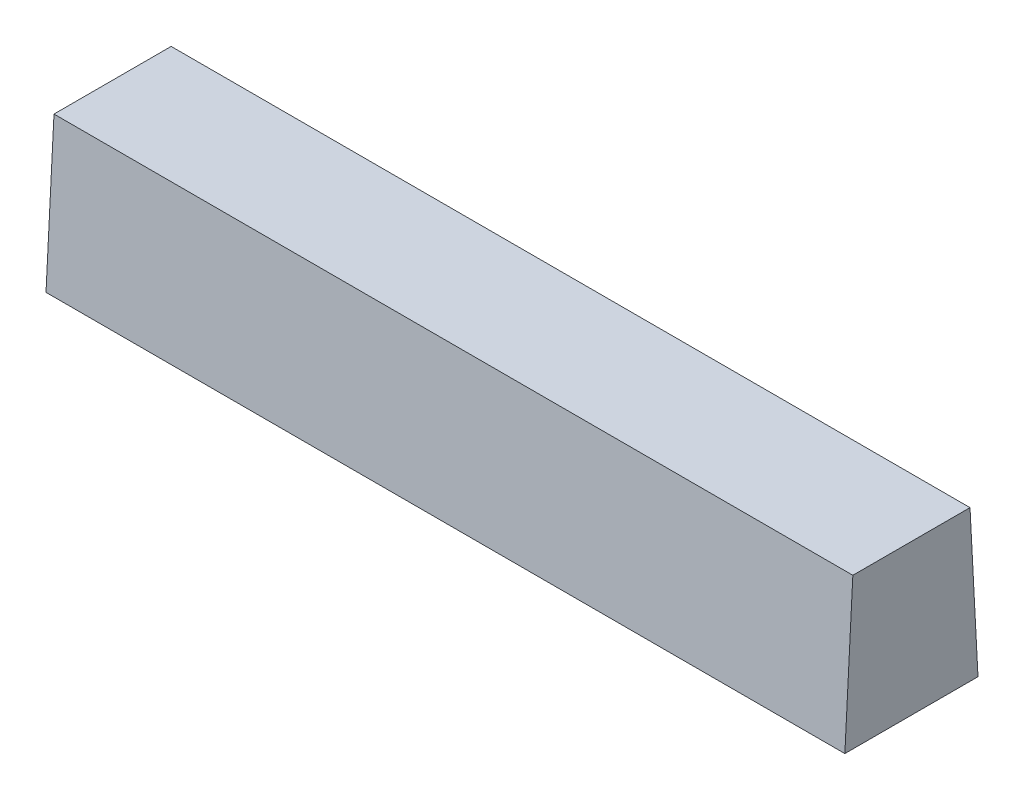
ISO-10303-21;
HEADER;
FILE_DESCRIPTION(('STEP AP214'),'2;1');
FILE_NAME('part.step','',(''),(''),'','','');
FILE_SCHEMA(('AUTOMOTIVE_DESIGN { 1 0 10303 214 1 1 1 1 }'));
ENDSEC;
DATA;
#1=APPLICATION_CONTEXT('core data for automotive mechanical design processes');
#2=APPLICATION_PROTOCOL_DEFINITION('international standard','automotive_design',2000,#1);
#3=PRODUCT_CONTEXT('',#1,'mechanical');
#4=PRODUCT('Part','Part','',(#3));
#5=PRODUCT_RELATED_PRODUCT_CATEGORY('part','',(#4));
#6=PRODUCT_DEFINITION_FORMATION('','',#4);
#7=PRODUCT_DEFINITION_CONTEXT('part definition',#1,'design');
#8=PRODUCT_DEFINITION('design','',#6,#7);
#9=PRODUCT_DEFINITION_SHAPE('','',#8);
#10=(LENGTH_UNIT() NAMED_UNIT(*) SI_UNIT(.MILLI.,.METRE.));
#11=(NAMED_UNIT(*) PLANE_ANGLE_UNIT() SI_UNIT($,.RADIAN.));
#12=(NAMED_UNIT(*) SI_UNIT($,.STERADIAN.) SOLID_ANGLE_UNIT());
#13=UNCERTAINTY_MEASURE_WITH_UNIT(LENGTH_MEASURE(1.E-05),#10,'distance_accuracy_value','');
#14=(GEOMETRIC_REPRESENTATION_CONTEXT(3) GLOBAL_UNCERTAINTY_ASSIGNED_CONTEXT((#13)) GLOBAL_UNIT_ASSIGNED_CONTEXT((#10,
#11,#12)) REPRESENTATION_CONTEXT('',''));
#15=CARTESIAN_POINT('',(0.,0.,0.));
#16=DIRECTION('',(0.,0.,1.));
#17=DIRECTION('',(1.,0.,0.));
#18=AXIS2_PLACEMENT_3D('',#15,#16,#17);
#19=CARTESIAN_POINT('',(6.,1.13,0.44));
#20=DIRECTION('',(0.,-0.0530226536130866,-0.998593309713132));
#21=DIRECTION('',(0.,0.998593309713132,-0.0530226536130866));
#22=AXIS2_PLACEMENT_3D('',#19,#20,#21);
#23=PLANE('',#22);
#24=DIRECTION('',(0.,-0.998593309713132,0.0530226536130866));
#25=VECTOR('',#24,1.);
#26=CARTESIAN_POINT('',(0.,1.13,0.44));
#27=LINE('',#26,#25);
#28=CARTESIAN_POINT('',(0.,1.13,0.44));
#29=VERTEX_POINT('',#28);
#30=CARTESIAN_POINT('',(0.,0.,0.5));
#31=VERTEX_POINT('',#30);
#32=EDGE_CURVE('E109',#29,#31,#27,.T.);
#33=ORIENTED_EDGE('',*,*,#32,.T.);
#34=DIRECTION('',(-1.,0.,0.));
#35=VECTOR('',#34,1.);
#36=CARTESIAN_POINT('',(6.,0.,0.5));
#37=LINE('',#36,#35);
#38=CARTESIAN_POINT('',(6.,0.,0.5));
#39=VERTEX_POINT('',#38);
#40=EDGE_CURVE('E11',#39,#31,#37,.T.);
#41=ORIENTED_EDGE('',*,*,#40,.F.);
#42=DIRECTION('',(0.,-0.998593309713132,0.0530226536130866));
#43=VECTOR('',#42,1.);
#44=CARTESIAN_POINT('',(6.,1.13,0.44));
#45=LINE('',#44,#43);
#46=CARTESIAN_POINT('',(6.,1.13,0.44));
#47=VERTEX_POINT('',#46);
#48=EDGE_CURVE('E93',#47,#39,#45,.T.);
#49=ORIENTED_EDGE('',*,*,#48,.F.);
#50=DIRECTION('',(-1.,0.,0.));
#51=VECTOR('',#50,1.);
#52=CARTESIAN_POINT('',(6.,1.13,0.44));
#53=LINE('',#52,#51);
#54=EDGE_CURVE('E105',#47,#29,#53,.T.);
#55=ORIENTED_EDGE('',*,*,#54,.T.);
#56=EDGE_LOOP('',(#33,#41,#49,#55));
#57=FACE_BOUND('',#56,.T.);
#58=ADVANCED_FACE('F41',(#57),#23,.F.);
#59=CARTESIAN_POINT('',(6.,0.,-0.5));
#60=DIRECTION('',(0.,1.,0.));
#61=DIRECTION('',(0.,0.,1.));
#62=AXIS2_PLACEMENT_3D('',#59,#60,#61);
#63=PLANE('',#62);
#64=DIRECTION('',(0.,0.,-1.));
#65=VECTOR('',#64,1.);
#66=CARTESIAN_POINT('',(0.,0.,-0.5));
#67=LINE('',#66,#65);
#68=CARTESIAN_POINT('',(0.,0.,-0.5));
#69=VERTEX_POINT('',#68);
#70=EDGE_CURVE('E98',#31,#69,#67,.T.);
#71=ORIENTED_EDGE('',*,*,#70,.T.);
#72=DIRECTION('',(-1.,0.,0.));
#73=VECTOR('',#72,1.);
#74=CARTESIAN_POINT('',(6.,0.,-0.5));
#75=LINE('',#74,#73);
#76=CARTESIAN_POINT('',(6.,0.,-0.5));
#77=VERTEX_POINT('',#76);
#78=EDGE_CURVE('E50',#77,#69,#75,.T.);
#79=ORIENTED_EDGE('',*,*,#78,.F.);
#80=DIRECTION('',(0.,0.,-1.));
#81=VECTOR('',#80,1.);
#82=CARTESIAN_POINT('',(6.,0.,-0.5));
#83=LINE('',#82,#81);
#84=EDGE_CURVE('E88',#39,#77,#83,.T.);
#85=ORIENTED_EDGE('',*,*,#84,.F.);
#86=ORIENTED_EDGE('',*,*,#40,.T.);
#87=EDGE_LOOP('',(#71,#79,#85,#86));
#88=FACE_BOUND('',#87,.T.);
#89=ADVANCED_FACE('F97',(#88),#63,.F.);
#90=CARTESIAN_POINT('',(6.,1.13,-0.44));
#91=DIRECTION('',(0.,-0.0530226536130866,0.998593309713132));
#92=DIRECTION('',(0.,-0.998593309713132,-0.0530226536130866));
#93=AXIS2_PLACEMENT_3D('',#90,#91,#92);
#94=PLANE('',#93);
#95=DIRECTION('',(0.,0.998593309713132,0.0530226536130866));
#96=VECTOR('',#95,1.);
#97=CARTESIAN_POINT('',(0.,1.13,-0.44));
#98=LINE('',#97,#96);
#99=CARTESIAN_POINT('',(0.,1.13,-0.44));
#100=VERTEX_POINT('',#99);
#101=EDGE_CURVE('E75',#69,#100,#98,.T.);
#102=ORIENTED_EDGE('',*,*,#101,.T.);
#103=DIRECTION('',(-1.,0.,0.));
#104=VECTOR('',#103,1.);
#105=CARTESIAN_POINT('',(6.,1.13,-0.44));
#106=LINE('',#105,#104);
#107=CARTESIAN_POINT('',(6.,1.13,-0.44));
#108=VERTEX_POINT('',#107);
#109=EDGE_CURVE('E100',#108,#100,#106,.T.);
#110=ORIENTED_EDGE('',*,*,#109,.F.);
#111=DIRECTION('',(0.,0.998593309713132,0.0530226536130866));
#112=VECTOR('',#111,1.);
#113=CARTESIAN_POINT('',(6.,1.13,-0.44));
#114=LINE('',#113,#112);
#115=EDGE_CURVE('E91',#77,#108,#114,.T.);
#116=ORIENTED_EDGE('',*,*,#115,.F.);
#117=ORIENTED_EDGE('',*,*,#78,.T.);
#118=EDGE_LOOP('',(#102,#110,#116,#117));
#119=FACE_BOUND('',#118,.T.);
#120=ADVANCED_FACE('F101',(#119),#94,.F.);
#121=CARTESIAN_POINT('',(6.,1.13,0.44));
#122=DIRECTION('',(0.,-1.,0.));
#123=DIRECTION('',(0.,0.,-1.));
#124=AXIS2_PLACEMENT_3D('',#121,#122,#123);
#125=PLANE('',#124);
#126=DIRECTION('',(0.,0.,1.));
#127=VECTOR('',#126,1.);
#128=CARTESIAN_POINT('',(0.,1.13,0.44));
#129=LINE('',#128,#127);
#130=EDGE_CURVE('E81',#100,#29,#129,.T.);
#131=ORIENTED_EDGE('',*,*,#130,.T.);
#132=ORIENTED_EDGE('',*,*,#54,.F.);
#133=DIRECTION('',(0.,0.,1.));
#134=VECTOR('',#133,1.);
#135=CARTESIAN_POINT('',(6.,1.13,0.44));
#136=LINE('',#135,#134);
#137=EDGE_CURVE('E58',#108,#47,#136,.T.);
#138=ORIENTED_EDGE('',*,*,#137,.F.);
#139=ORIENTED_EDGE('',*,*,#109,.T.);
#140=EDGE_LOOP('',(#131,#132,#138,#139));
#141=FACE_BOUND('',#140,.T.);
#142=ADVANCED_FACE('F122',(#141),#125,.F.);
#143=CARTESIAN_POINT('',(6.,0.,0.));
#144=DIRECTION('',(-1.,0.,0.));
#145=DIRECTION('',(0.,0.,1.));
#146=AXIS2_PLACEMENT_3D('',#143,#144,#145);
#147=PLANE('',#146);
#148=ORIENTED_EDGE('',*,*,#48,.T.);
#149=ORIENTED_EDGE('',*,*,#84,.T.);
#150=ORIENTED_EDGE('',*,*,#115,.T.);
#151=ORIENTED_EDGE('',*,*,#137,.T.);
#152=EDGE_LOOP('',(#148,#149,#150,#151));
#153=FACE_BOUND('',#152,.T.);
#154=ADVANCED_FACE('F89',(#153),#147,.F.);
#155=CARTESIAN_POINT('',(0.,0.,0.));
#156=DIRECTION('',(-1.,0.,0.));
#157=DIRECTION('',(0.,0.,1.));
#158=AXIS2_PLACEMENT_3D('',#155,#156,#157);
#159=PLANE('',#158);
#160=ORIENTED_EDGE('',*,*,#32,.F.);
#161=ORIENTED_EDGE('',*,*,#130,.F.);
#162=ORIENTED_EDGE('',*,*,#101,.F.);
#163=ORIENTED_EDGE('',*,*,#70,.F.);
#164=EDGE_LOOP('',(#160,#161,#162,#163));
#165=FACE_BOUND('',#164,.T.);
#166=ADVANCED_FACE('F125',(#165),#159,.T.);
#167=CLOSED_SHELL('',(#58,#89,#120,#142,#154,#166));
#168=MANIFOLD_SOLID_BREP('B2',#167);
#169=ADVANCED_BREP_SHAPE_REPRESENTATION('',(#18,#168),#14);
#170=SHAPE_DEFINITION_REPRESENTATION(#9,#169);
ENDSEC;
END-ISO-10303-21;
